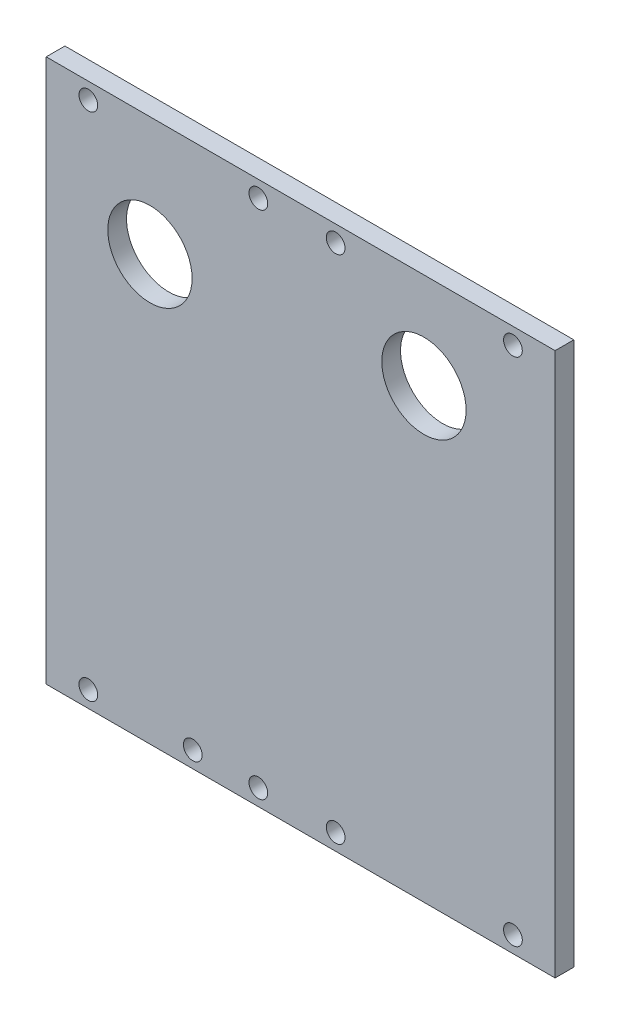
ISO-10303-21;
HEADER;
FILE_DESCRIPTION(('STEP AP214'),'2;1');
FILE_NAME('part.step','',(''),(''),'','','');
FILE_SCHEMA(('AUTOMOTIVE_DESIGN { 1 0 10303 214 1 1 1 1 }'));
ENDSEC;
DATA;
#1=APPLICATION_CONTEXT('core data for automotive mechanical design processes');
#2=APPLICATION_PROTOCOL_DEFINITION('international standard','automotive_design',2000,#1);
#3=PRODUCT_CONTEXT('',#1,'mechanical');
#4=PRODUCT('Part','Part','',(#3));
#5=PRODUCT_RELATED_PRODUCT_CATEGORY('part','',(#4));
#6=PRODUCT_DEFINITION_FORMATION('','',#4);
#7=PRODUCT_DEFINITION_CONTEXT('part definition',#1,'design');
#8=PRODUCT_DEFINITION('design','',#6,#7);
#9=PRODUCT_DEFINITION_SHAPE('','',#8);
#10=(LENGTH_UNIT() NAMED_UNIT(*) SI_UNIT(.MILLI.,.METRE.));
#11=(NAMED_UNIT(*) PLANE_ANGLE_UNIT() SI_UNIT($,.RADIAN.));
#12=(NAMED_UNIT(*) SI_UNIT($,.STERADIAN.) SOLID_ANGLE_UNIT());
#13=UNCERTAINTY_MEASURE_WITH_UNIT(LENGTH_MEASURE(1.E-05),#10,'distance_accuracy_value','');
#14=(GEOMETRIC_REPRESENTATION_CONTEXT(3) GLOBAL_UNCERTAINTY_ASSIGNED_CONTEXT((#13)) GLOBAL_UNIT_ASSIGNED_CONTEXT((#10,
#11,#12)) REPRESENTATION_CONTEXT('',''));
#15=CARTESIAN_POINT('',(0.,0.,0.));
#16=DIRECTION('',(0.,0.,1.));
#17=DIRECTION('',(1.,0.,0.));
#18=AXIS2_PLACEMENT_3D('',#15,#16,#17);
#19=CARTESIAN_POINT('',(54.325,-58.,4.));
#20=DIRECTION('',(-1.,0.,0.));
#21=DIRECTION('',(0.,0.,1.));
#22=AXIS2_PLACEMENT_3D('',#19,#20,#21);
#23=PLANE('',#22);
#24=DIRECTION('',(0.,1.,0.));
#25=VECTOR('',#24,1.);
#26=CARTESIAN_POINT('',(54.325,-58.,0.));
#27=LINE('',#26,#25);
#28=CARTESIAN_POINT('',(54.325,-58.,0.));
#29=VERTEX_POINT('',#28);
#30=CARTESIAN_POINT('',(54.325,58.,0.));
#31=VERTEX_POINT('',#30);
#32=EDGE_CURVE('E102',#29,#31,#27,.T.);
#33=ORIENTED_EDGE('',*,*,#32,.T.);
#34=DIRECTION('',(0.,0.,-1.));
#35=VECTOR('',#34,1.);
#36=CARTESIAN_POINT('',(54.325,58.,4.));
#37=LINE('',#36,#35);
#38=CARTESIAN_POINT('',(54.325,58.,4.));
#39=VERTEX_POINT('',#38);
#40=EDGE_CURVE('E11',#39,#31,#37,.T.);
#41=ORIENTED_EDGE('',*,*,#40,.F.);
#42=DIRECTION('',(0.,1.,0.));
#43=VECTOR('',#42,1.);
#44=CARTESIAN_POINT('',(54.325,-58.,4.));
#45=LINE('',#44,#43);
#46=CARTESIAN_POINT('',(54.325,-58.,4.));
#47=VERTEX_POINT('',#46);
#48=EDGE_CURVE('E90',#47,#39,#45,.T.);
#49=ORIENTED_EDGE('',*,*,#48,.F.);
#50=DIRECTION('',(0.,0.,-1.));
#51=VECTOR('',#50,1.);
#52=CARTESIAN_POINT('',(54.325,-58.,4.));
#53=LINE('',#52,#51);
#54=EDGE_CURVE('E98',#47,#29,#53,.T.);
#55=ORIENTED_EDGE('',*,*,#54,.T.);
#56=EDGE_LOOP('',(#33,#41,#49,#55));
#57=FACE_BOUND('',#56,.T.);
#58=ADVANCED_FACE('F39',(#57),#23,.F.);
#59=CARTESIAN_POINT('',(-54.325,58.,4.));
#60=DIRECTION('',(0.,-1.,0.));
#61=DIRECTION('',(0.,0.,-1.));
#62=AXIS2_PLACEMENT_3D('',#59,#60,#61);
#63=PLANE('',#62);
#64=DIRECTION('',(-1.,0.,0.));
#65=VECTOR('',#64,1.);
#66=CARTESIAN_POINT('',(-54.325,58.,0.));
#67=LINE('',#66,#65);
#68=CARTESIAN_POINT('',(-54.325,58.,0.));
#69=VERTEX_POINT('',#68);
#70=EDGE_CURVE('E94',#31,#69,#67,.T.);
#71=ORIENTED_EDGE('',*,*,#70,.T.);
#72=DIRECTION('',(0.,0.,-1.));
#73=VECTOR('',#72,1.);
#74=CARTESIAN_POINT('',(-54.325,58.,4.));
#75=LINE('',#74,#73);
#76=CARTESIAN_POINT('',(-54.325,58.,4.));
#77=VERTEX_POINT('',#76);
#78=EDGE_CURVE('E47',#77,#69,#75,.T.);
#79=ORIENTED_EDGE('',*,*,#78,.F.);
#80=DIRECTION('',(-1.,0.,0.));
#81=VECTOR('',#80,1.);
#82=CARTESIAN_POINT('',(-54.325,58.,4.));
#83=LINE('',#82,#81);
#84=EDGE_CURVE('E85',#39,#77,#83,.T.);
#85=ORIENTED_EDGE('',*,*,#84,.F.);
#86=ORIENTED_EDGE('',*,*,#40,.T.);
#87=EDGE_LOOP('',(#71,#79,#85,#86));
#88=FACE_BOUND('',#87,.T.);
#89=ADVANCED_FACE('F93',(#88),#63,.F.);
#90=CARTESIAN_POINT('',(-54.325,-58.,4.));
#91=DIRECTION('',(1.,0.,0.));
#92=DIRECTION('',(0.,0.,-1.));
#93=AXIS2_PLACEMENT_3D('',#90,#91,#92);
#94=PLANE('',#93);
#95=DIRECTION('',(0.,-1.,0.));
#96=VECTOR('',#95,1.);
#97=CARTESIAN_POINT('',(-54.325,-58.,0.));
#98=LINE('',#97,#96);
#99=CARTESIAN_POINT('',(-54.325,-58.,0.));
#100=VERTEX_POINT('',#99);
#101=EDGE_CURVE('E72',#69,#100,#98,.T.);
#102=ORIENTED_EDGE('',*,*,#101,.T.);
#103=DIRECTION('',(0.,0.,-1.));
#104=VECTOR('',#103,1.);
#105=CARTESIAN_POINT('',(-54.325,-58.,4.));
#106=LINE('',#105,#104);
#107=CARTESIAN_POINT('',(-54.325,-58.,4.));
#108=VERTEX_POINT('',#107);
#109=EDGE_CURVE('E95',#108,#100,#106,.T.);
#110=ORIENTED_EDGE('',*,*,#109,.F.);
#111=DIRECTION('',(0.,-1.,0.));
#112=VECTOR('',#111,1.);
#113=CARTESIAN_POINT('',(-54.325,-58.,4.));
#114=LINE('',#113,#112);
#115=EDGE_CURVE('E88',#77,#108,#114,.T.);
#116=ORIENTED_EDGE('',*,*,#115,.F.);
#117=ORIENTED_EDGE('',*,*,#78,.T.);
#118=EDGE_LOOP('',(#102,#110,#116,#117));
#119=FACE_BOUND('',#118,.T.);
#120=ADVANCED_FACE('F96',(#119),#94,.F.);
#121=CARTESIAN_POINT('',(-54.325,-58.,4.));
#122=DIRECTION('',(0.,1.,0.));
#123=DIRECTION('',(0.,0.,1.));
#124=AXIS2_PLACEMENT_3D('',#121,#122,#123);
#125=PLANE('',#124);
#126=DIRECTION('',(1.,0.,0.));
#127=VECTOR('',#126,1.);
#128=CARTESIAN_POINT('',(-54.325,-58.,0.));
#129=LINE('',#128,#127);
#130=EDGE_CURVE('E78',#100,#29,#129,.T.);
#131=ORIENTED_EDGE('',*,*,#130,.T.);
#132=ORIENTED_EDGE('',*,*,#54,.F.);
#133=DIRECTION('',(1.,0.,0.));
#134=VECTOR('',#133,1.);
#135=CARTESIAN_POINT('',(-54.325,-58.,4.));
#136=LINE('',#135,#134);
#137=EDGE_CURVE('E55',#108,#47,#136,.T.);
#138=ORIENTED_EDGE('',*,*,#137,.F.);
#139=ORIENTED_EDGE('',*,*,#109,.T.);
#140=EDGE_LOOP('',(#131,#132,#138,#139));
#141=FACE_BOUND('',#140,.T.);
#142=ADVANCED_FACE('F110',(#141),#125,.F.);
#143=CARTESIAN_POINT('',(0.,0.,4.));
#144=DIRECTION('',(0.,0.,-1.));
#145=DIRECTION('',(-1.,0.,0.));
#146=AXIS2_PLACEMENT_3D('',#143,#144,#145);
#147=PLANE('',#146);
#148=CARTESIAN_POINT('',(45.325,-54.5,4.));
#149=DIRECTION('',(0.,0.,1.));
#150=DIRECTION('',(-1.,0.,0.));
#151=AXIS2_PLACEMENT_3D('',#148,#149,#150);
#152=CIRCLE('',#151,2.);
#153=CARTESIAN_POINT('',(43.325,-54.5,4.));
#154=VERTEX_POINT('',#153);
#155=EDGE_CURVE('E137',#154,#154,#152,.T.);
#156=ORIENTED_EDGE('',*,*,#155,.F.);
#157=EDGE_LOOP('',(#156));
#158=FACE_BOUND('',#157,.T.);
#159=CARTESIAN_POINT('',(45.325,54.5,4.));
#160=DIRECTION('',(0.,0.,1.));
#161=DIRECTION('',(1.,0.,0.));
#162=AXIS2_PLACEMENT_3D('',#159,#160,#161);
#163=CIRCLE('',#162,2.);
#164=CARTESIAN_POINT('',(47.325,54.5,4.));
#165=VERTEX_POINT('',#164);
#166=EDGE_CURVE('E143',#165,#165,#163,.T.);
#167=ORIENTED_EDGE('',*,*,#166,.F.);
#168=EDGE_LOOP('',(#167));
#169=FACE_BOUND('',#168,.T.);
#170=CARTESIAN_POINT('',(7.47500000000001,-54.5,4.));
#171=DIRECTION('',(0.,0.,1.));
#172=DIRECTION('',(-1.,0.,0.));
#173=AXIS2_PLACEMENT_3D('',#170,#171,#172);
#174=CIRCLE('',#173,2.);
#175=CARTESIAN_POINT('',(5.47500000000001,-54.5,4.));
#176=VERTEX_POINT('',#175);
#177=EDGE_CURVE('E149',#176,#176,#174,.T.);
#178=ORIENTED_EDGE('',*,*,#177,.F.);
#179=EDGE_LOOP('',(#178));
#180=FACE_BOUND('',#179,.T.);
#181=CARTESIAN_POINT('',(7.47500000000001,54.5,4.));
#182=DIRECTION('',(0.,0.,1.));
#183=DIRECTION('',(1.,0.,0.));
#184=AXIS2_PLACEMENT_3D('',#181,#182,#183);
#185=CIRCLE('',#184,2.);
#186=CARTESIAN_POINT('',(9.47500000000001,54.5,4.));
#187=VERTEX_POINT('',#186);
#188=EDGE_CURVE('E155',#187,#187,#185,.T.);
#189=ORIENTED_EDGE('',*,*,#188,.F.);
#190=EDGE_LOOP('',(#189));
#191=FACE_BOUND('',#190,.T.);
#192=CARTESIAN_POINT('',(-45.325,-54.5,4.));
#193=DIRECTION('',(0.,0.,1.));
#194=DIRECTION('',(-1.,0.,0.));
#195=AXIS2_PLACEMENT_3D('',#192,#193,#194);
#196=CIRCLE('',#195,2.);
#197=CARTESIAN_POINT('',(-47.325,-54.5,4.));
#198=VERTEX_POINT('',#197);
#199=EDGE_CURVE('E131',#198,#198,#196,.T.);
#200=ORIENTED_EDGE('',*,*,#199,.F.);
#201=EDGE_LOOP('',(#200));
#202=FACE_BOUND('',#201,.T.);
#203=CARTESIAN_POINT('',(-9.02499999999999,54.5,4.));
#204=DIRECTION('',(0.,0.,1.));
#205=DIRECTION('',(-1.,0.,0.));
#206=AXIS2_PLACEMENT_3D('',#203,#204,#205);
#207=CIRCLE('',#206,2.);
#208=CARTESIAN_POINT('',(-11.025,54.5,4.));
#209=VERTEX_POINT('',#208);
#210=EDGE_CURVE('E162',#209,#209,#207,.T.);
#211=ORIENTED_EDGE('',*,*,#210,.F.);
#212=EDGE_LOOP('',(#211));
#213=FACE_BOUND('',#212,.T.);
#214=CARTESIAN_POINT('',(-9.02499999999999,-54.5,4.));
#215=DIRECTION('',(0.,0.,1.));
#216=DIRECTION('',(1.,0.,0.));
#217=AXIS2_PLACEMENT_3D('',#214,#215,#216);
#218=CIRCLE('',#217,2.);
#219=CARTESIAN_POINT('',(-7.02499999999999,-54.5,4.));
#220=VERTEX_POINT('',#219);
#221=EDGE_CURVE('E163',#220,#220,#218,.T.);
#222=ORIENTED_EDGE('',*,*,#221,.F.);
#223=EDGE_LOOP('',(#222));
#224=FACE_BOUND('',#223,.T.);
#225=CARTESIAN_POINT('',(-23.025,-54.5,4.));
#226=DIRECTION('',(0.,0.,1.));
#227=DIRECTION('',(-1.,0.,0.));
#228=AXIS2_PLACEMENT_3D('',#225,#226,#227);
#229=CIRCLE('',#228,2.);
#230=CARTESIAN_POINT('',(-25.025,-54.5,4.));
#231=VERTEX_POINT('',#230);
#232=EDGE_CURVE('E173',#231,#231,#229,.T.);
#233=ORIENTED_EDGE('',*,*,#232,.F.);
#234=EDGE_LOOP('',(#233));
#235=FACE_BOUND('',#234,.T.);
#236=CARTESIAN_POINT('',(-45.325,54.5,4.));
#237=DIRECTION('',(0.,0.,1.));
#238=DIRECTION('',(1.,0.,0.));
#239=AXIS2_PLACEMENT_3D('',#236,#237,#238);
#240=CIRCLE('',#239,2.);
#241=CARTESIAN_POINT('',(-43.325,54.5,4.));
#242=VERTEX_POINT('',#241);
#243=EDGE_CURVE('E128',#242,#242,#240,.T.);
#244=ORIENTED_EDGE('',*,*,#243,.F.);
#245=EDGE_LOOP('',(#244));
#246=FACE_BOUND('',#245,.T.);
#247=CARTESIAN_POINT('',(26.325,37.5,4.));
#248=DIRECTION('',(0.,0.,1.));
#249=DIRECTION('',(1.,0.,0.));
#250=AXIS2_PLACEMENT_3D('',#247,#248,#249);
#251=CIRCLE('',#250,9.);
#252=CARTESIAN_POINT('',(35.325,37.5,4.));
#253=VERTEX_POINT('',#252);
#254=EDGE_CURVE('E123',#253,#253,#251,.T.);
#255=ORIENTED_EDGE('',*,*,#254,.F.);
#256=EDGE_LOOP('',(#255));
#257=FACE_BOUND('',#256,.T.);
#258=CARTESIAN_POINT('',(-32.175,32.6,4.));
#259=DIRECTION('',(0.,0.,1.));
#260=DIRECTION('',(1.,0.,0.));
#261=AXIS2_PLACEMENT_3D('',#258,#259,#260);
#262=CIRCLE('',#261,9.);
#263=CARTESIAN_POINT('',(-23.175,32.6,4.));
#264=VERTEX_POINT('',#263);
#265=EDGE_CURVE('E119',#264,#264,#262,.T.);
#266=ORIENTED_EDGE('',*,*,#265,.F.);
#267=EDGE_LOOP('',(#266));
#268=FACE_BOUND('',#267,.T.);
#269=ORIENTED_EDGE('',*,*,#48,.T.);
#270=ORIENTED_EDGE('',*,*,#84,.T.);
#271=ORIENTED_EDGE('',*,*,#115,.T.);
#272=ORIENTED_EDGE('',*,*,#137,.T.);
#273=EDGE_LOOP('',(#269,#270,#271,#272));
#274=FACE_BOUND('',#273,.T.);
#275=ADVANCED_FACE('F86',(#158,#169,#180,#191,#202,#213,#224,#235,#246,#257,#268,#274),#147,.F.);
#276=CARTESIAN_POINT('',(0.,0.,0.));
#277=DIRECTION('',(0.,0.,-1.));
#278=DIRECTION('',(-1.,0.,0.));
#279=AXIS2_PLACEMENT_3D('',#276,#277,#278);
#280=PLANE('',#279);
#281=CARTESIAN_POINT('',(45.325,-54.5,0.));
#282=DIRECTION('',(0.,0.,1.));
#283=DIRECTION('',(-1.,0.,0.));
#284=AXIS2_PLACEMENT_3D('',#281,#282,#283);
#285=CIRCLE('',#284,2.);
#286=CARTESIAN_POINT('',(43.325,-54.5,0.));
#287=VERTEX_POINT('',#286);
#288=EDGE_CURVE('E134',#287,#287,#285,.T.);
#289=ORIENTED_EDGE('',*,*,#288,.T.);
#290=EDGE_LOOP('',(#289));
#291=FACE_BOUND('',#290,.T.);
#292=CARTESIAN_POINT('',(45.325,54.5,0.));
#293=DIRECTION('',(0.,0.,1.));
#294=DIRECTION('',(1.,0.,0.));
#295=AXIS2_PLACEMENT_3D('',#292,#293,#294);
#296=CIRCLE('',#295,2.);
#297=CARTESIAN_POINT('',(47.325,54.5,0.));
#298=VERTEX_POINT('',#297);
#299=EDGE_CURVE('E140',#298,#298,#296,.T.);
#300=ORIENTED_EDGE('',*,*,#299,.T.);
#301=EDGE_LOOP('',(#300));
#302=FACE_BOUND('',#301,.T.);
#303=CARTESIAN_POINT('',(7.47500000000001,-54.5,0.));
#304=DIRECTION('',(0.,0.,1.));
#305=DIRECTION('',(-1.,0.,0.));
#306=AXIS2_PLACEMENT_3D('',#303,#304,#305);
#307=CIRCLE('',#306,2.);
#308=CARTESIAN_POINT('',(5.47500000000001,-54.5,0.));
#309=VERTEX_POINT('',#308);
#310=EDGE_CURVE('E146',#309,#309,#307,.T.);
#311=ORIENTED_EDGE('',*,*,#310,.T.);
#312=EDGE_LOOP('',(#311));
#313=FACE_BOUND('',#312,.T.);
#314=CARTESIAN_POINT('',(7.47500000000001,54.5,0.));
#315=DIRECTION('',(0.,0.,1.));
#316=DIRECTION('',(1.,0.,0.));
#317=AXIS2_PLACEMENT_3D('',#314,#315,#316);
#318=CIRCLE('',#317,2.);
#319=CARTESIAN_POINT('',(9.47500000000001,54.5,0.));
#320=VERTEX_POINT('',#319);
#321=EDGE_CURVE('E152',#320,#320,#318,.T.);
#322=ORIENTED_EDGE('',*,*,#321,.T.);
#323=EDGE_LOOP('',(#322));
#324=FACE_BOUND('',#323,.T.);
#325=CARTESIAN_POINT('',(-45.325,-54.5,0.));
#326=DIRECTION('',(0.,0.,1.));
#327=DIRECTION('',(-1.,0.,0.));
#328=AXIS2_PLACEMENT_3D('',#325,#326,#327);
#329=CIRCLE('',#328,2.);
#330=CARTESIAN_POINT('',(-47.325,-54.5,0.));
#331=VERTEX_POINT('',#330);
#332=EDGE_CURVE('E166',#331,#331,#329,.T.);
#333=ORIENTED_EDGE('',*,*,#332,.T.);
#334=EDGE_LOOP('',(#333));
#335=FACE_BOUND('',#334,.T.);
#336=CARTESIAN_POINT('',(-9.02499999999999,54.5,0.));
#337=DIRECTION('',(0.,0.,1.));
#338=DIRECTION('',(-1.,0.,0.));
#339=AXIS2_PLACEMENT_3D('',#336,#337,#338);
#340=CIRCLE('',#339,2.);
#341=CARTESIAN_POINT('',(-11.025,54.5,0.));
#342=VERTEX_POINT('',#341);
#343=EDGE_CURVE('E159',#342,#342,#340,.T.);
#344=ORIENTED_EDGE('',*,*,#343,.T.);
#345=EDGE_LOOP('',(#344));
#346=FACE_BOUND('',#345,.T.);
#347=CARTESIAN_POINT('',(-9.02499999999999,-54.5,0.));
#348=DIRECTION('',(0.,0.,1.));
#349=DIRECTION('',(1.,0.,0.));
#350=AXIS2_PLACEMENT_3D('',#347,#348,#349);
#351=CIRCLE('',#350,2.);
#352=CARTESIAN_POINT('',(-7.02499999999999,-54.5,0.));
#353=VERTEX_POINT('',#352);
#354=EDGE_CURVE('E176',#353,#353,#351,.T.);
#355=ORIENTED_EDGE('',*,*,#354,.T.);
#356=EDGE_LOOP('',(#355));
#357=FACE_BOUND('',#356,.T.);
#358=CARTESIAN_POINT('',(-23.025,-54.5,0.));
#359=DIRECTION('',(0.,0.,1.));
#360=DIRECTION('',(-1.,0.,0.));
#361=AXIS2_PLACEMENT_3D('',#358,#359,#360);
#362=CIRCLE('',#361,2.);
#363=CARTESIAN_POINT('',(-25.025,-54.5,0.));
#364=VERTEX_POINT('',#363);
#365=EDGE_CURVE('E158',#364,#364,#362,.T.);
#366=ORIENTED_EDGE('',*,*,#365,.T.);
#367=EDGE_LOOP('',(#366));
#368=FACE_BOUND('',#367,.T.);
#369=CARTESIAN_POINT('',(-45.325,54.5,0.));
#370=DIRECTION('',(0.,0.,1.));
#371=DIRECTION('',(1.,0.,0.));
#372=AXIS2_PLACEMENT_3D('',#369,#370,#371);
#373=CIRCLE('',#372,2.);
#374=CARTESIAN_POINT('',(-43.325,54.5,0.));
#375=VERTEX_POINT('',#374);
#376=EDGE_CURVE('E120',#375,#375,#373,.T.);
#377=ORIENTED_EDGE('',*,*,#376,.T.);
#378=EDGE_LOOP('',(#377));
#379=FACE_BOUND('',#378,.T.);
#380=CARTESIAN_POINT('',(26.325,37.5,0.));
#381=DIRECTION('',(0.,0.,1.));
#382=DIRECTION('',(1.,0.,0.));
#383=AXIS2_PLACEMENT_3D('',#380,#381,#382);
#384=CIRCLE('',#383,9.);
#385=CARTESIAN_POINT('',(35.325,37.5,0.));
#386=VERTEX_POINT('',#385);
#387=EDGE_CURVE('E105',#386,#386,#384,.T.);
#388=ORIENTED_EDGE('',*,*,#387,.T.);
#389=EDGE_LOOP('',(#388));
#390=FACE_BOUND('',#389,.T.);
#391=CARTESIAN_POINT('',(-32.175,32.6,0.));
#392=DIRECTION('',(0.,0.,1.));
#393=DIRECTION('',(1.,0.,0.));
#394=AXIS2_PLACEMENT_3D('',#391,#392,#393);
#395=CIRCLE('',#394,9.);
#396=CARTESIAN_POINT('',(-23.175,32.6,0.));
#397=VERTEX_POINT('',#396);
#398=EDGE_CURVE('E116',#397,#397,#395,.T.);
#399=ORIENTED_EDGE('',*,*,#398,.T.);
#400=EDGE_LOOP('',(#399));
#401=FACE_BOUND('',#400,.T.);
#402=ORIENTED_EDGE('',*,*,#32,.F.);
#403=ORIENTED_EDGE('',*,*,#130,.F.);
#404=ORIENTED_EDGE('',*,*,#101,.F.);
#405=ORIENTED_EDGE('',*,*,#70,.F.);
#406=EDGE_LOOP('',(#402,#403,#404,#405));
#407=FACE_BOUND('',#406,.T.);
#408=ADVANCED_FACE('F113',(#291,#302,#313,#324,#335,#346,#357,#368,#379,#390,#401,#407),#280,.T.);
#409=CARTESIAN_POINT('',(-32.175,32.6,0.));
#410=DIRECTION('',(0.,0.,1.));
#411=DIRECTION('',(1.,0.,0.));
#412=AXIS2_PLACEMENT_3D('',#409,#410,#411);
#413=CYLINDRICAL_SURFACE('',#412,9.);
#414=ORIENTED_EDGE('',*,*,#398,.F.);
#415=EDGE_LOOP('',(#414));
#416=FACE_BOUND('',#415,.T.);
#417=ORIENTED_EDGE('',*,*,#265,.T.);
#418=EDGE_LOOP('',(#417));
#419=FACE_BOUND('',#418,.T.);
#420=ADVANCED_FACE('F196',(#416,#419),#413,.F.);
#421=CARTESIAN_POINT('',(26.325,37.5,0.));
#422=DIRECTION('',(0.,0.,1.));
#423=DIRECTION('',(1.,0.,0.));
#424=AXIS2_PLACEMENT_3D('',#421,#422,#423);
#425=CYLINDRICAL_SURFACE('',#424,9.);
#426=ORIENTED_EDGE('',*,*,#387,.F.);
#427=EDGE_LOOP('',(#426));
#428=FACE_BOUND('',#427,.T.);
#429=ORIENTED_EDGE('',*,*,#254,.T.);
#430=EDGE_LOOP('',(#429));
#431=FACE_BOUND('',#430,.T.);
#432=ADVANCED_FACE('F198',(#428,#431),#425,.F.);
#433=CARTESIAN_POINT('',(-45.325,54.5,0.));
#434=DIRECTION('',(0.,0.,1.));
#435=DIRECTION('',(1.,0.,0.));
#436=AXIS2_PLACEMENT_3D('',#433,#434,#435);
#437=CYLINDRICAL_SURFACE('',#436,2.);
#438=ORIENTED_EDGE('',*,*,#376,.F.);
#439=EDGE_LOOP('',(#438));
#440=FACE_BOUND('',#439,.T.);
#441=ORIENTED_EDGE('',*,*,#243,.T.);
#442=EDGE_LOOP('',(#441));
#443=FACE_BOUND('',#442,.T.);
#444=ADVANCED_FACE('F205',(#440,#443),#437,.F.);
#445=CARTESIAN_POINT('',(-23.025,-54.5,0.));
#446=DIRECTION('',(0.,0.,1.));
#447=DIRECTION('',(1.,0.,0.));
#448=AXIS2_PLACEMENT_3D('',#445,#446,#447);
#449=CYLINDRICAL_SURFACE('',#448,2.);
#450=ORIENTED_EDGE('',*,*,#365,.F.);
#451=EDGE_LOOP('',(#450));
#452=FACE_BOUND('',#451,.T.);
#453=ORIENTED_EDGE('',*,*,#232,.T.);
#454=EDGE_LOOP('',(#453));
#455=FACE_BOUND('',#454,.T.);
#456=ADVANCED_FACE('F265',(#452,#455),#449,.F.);
#457=CARTESIAN_POINT('',(-9.02499999999999,-54.5,0.));
#458=DIRECTION('',(0.,0.,1.));
#459=DIRECTION('',(1.,0.,0.));
#460=AXIS2_PLACEMENT_3D('',#457,#458,#459);
#461=CYLINDRICAL_SURFACE('',#460,2.);
#462=ORIENTED_EDGE('',*,*,#354,.F.);
#463=EDGE_LOOP('',(#462));
#464=FACE_BOUND('',#463,.T.);
#465=ORIENTED_EDGE('',*,*,#221,.T.);
#466=EDGE_LOOP('',(#465));
#467=FACE_BOUND('',#466,.T.);
#468=ADVANCED_FACE('F182',(#464,#467),#461,.F.);
#469=CARTESIAN_POINT('',(-9.02499999999999,54.5,0.));
#470=DIRECTION('',(0.,0.,1.));
#471=DIRECTION('',(1.,0.,0.));
#472=AXIS2_PLACEMENT_3D('',#469,#470,#471);
#473=CYLINDRICAL_SURFACE('',#472,2.);
#474=ORIENTED_EDGE('',*,*,#343,.F.);
#475=EDGE_LOOP('',(#474));
#476=FACE_BOUND('',#475,.T.);
#477=ORIENTED_EDGE('',*,*,#210,.T.);
#478=EDGE_LOOP('',(#477));
#479=FACE_BOUND('',#478,.T.);
#480=ADVANCED_FACE('F282',(#476,#479),#473,.F.);
#481=CARTESIAN_POINT('',(-45.325,-54.5,0.));
#482=DIRECTION('',(0.,0.,1.));
#483=DIRECTION('',(1.,0.,0.));
#484=AXIS2_PLACEMENT_3D('',#481,#482,#483);
#485=CYLINDRICAL_SURFACE('',#484,2.);
#486=ORIENTED_EDGE('',*,*,#332,.F.);
#487=EDGE_LOOP('',(#486));
#488=FACE_BOUND('',#487,.T.);
#489=ORIENTED_EDGE('',*,*,#199,.T.);
#490=EDGE_LOOP('',(#489));
#491=FACE_BOUND('',#490,.T.);
#492=ADVANCED_FACE('F291',(#488,#491),#485,.F.);
#493=CARTESIAN_POINT('',(7.47500000000001,54.5,0.));
#494=DIRECTION('',(0.,0.,1.));
#495=DIRECTION('',(1.,0.,0.));
#496=AXIS2_PLACEMENT_3D('',#493,#494,#495);
#497=CYLINDRICAL_SURFACE('',#496,2.);
#498=ORIENTED_EDGE('',*,*,#321,.F.);
#499=EDGE_LOOP('',(#498));
#500=FACE_BOUND('',#499,.T.);
#501=ORIENTED_EDGE('',*,*,#188,.T.);
#502=EDGE_LOOP('',(#501));
#503=FACE_BOUND('',#502,.T.);
#504=ADVANCED_FACE('F300',(#500,#503),#497,.F.);
#505=CARTESIAN_POINT('',(7.47500000000001,-54.5,0.));
#506=DIRECTION('',(0.,0.,1.));
#507=DIRECTION('',(1.,0.,0.));
#508=AXIS2_PLACEMENT_3D('',#505,#506,#507);
#509=CYLINDRICAL_SURFACE('',#508,2.);
#510=ORIENTED_EDGE('',*,*,#310,.F.);
#511=EDGE_LOOP('',(#510));
#512=FACE_BOUND('',#511,.T.);
#513=ORIENTED_EDGE('',*,*,#177,.T.);
#514=EDGE_LOOP('',(#513));
#515=FACE_BOUND('',#514,.T.);
#516=ADVANCED_FACE('F309',(#512,#515),#509,.F.);
#517=CARTESIAN_POINT('',(45.325,54.5,0.));
#518=DIRECTION('',(0.,0.,1.));
#519=DIRECTION('',(1.,0.,0.));
#520=AXIS2_PLACEMENT_3D('',#517,#518,#519);
#521=CYLINDRICAL_SURFACE('',#520,2.);
#522=ORIENTED_EDGE('',*,*,#299,.F.);
#523=EDGE_LOOP('',(#522));
#524=FACE_BOUND('',#523,.T.);
#525=ORIENTED_EDGE('',*,*,#166,.T.);
#526=EDGE_LOOP('',(#525));
#527=FACE_BOUND('',#526,.T.);
#528=ADVANCED_FACE('F318',(#524,#527),#521,.F.);
#529=CARTESIAN_POINT('',(45.325,-54.5,0.));
#530=DIRECTION('',(0.,0.,1.));
#531=DIRECTION('',(1.,0.,0.));
#532=AXIS2_PLACEMENT_3D('',#529,#530,#531);
#533=CYLINDRICAL_SURFACE('',#532,2.);
#534=ORIENTED_EDGE('',*,*,#288,.F.);
#535=EDGE_LOOP('',(#534));
#536=FACE_BOUND('',#535,.T.);
#537=ORIENTED_EDGE('',*,*,#155,.T.);
#538=EDGE_LOOP('',(#537));
#539=FACE_BOUND('',#538,.T.);
#540=ADVANCED_FACE('F327',(#536,#539),#533,.F.);
#541=CLOSED_SHELL('',(#58,#89,#120,#142,#275,#408,#420,#432,#444,#456,#468,#480,#492,#504,#516,
#528,#540));
#542=MANIFOLD_SOLID_BREP('B2',#541);
#543=ADVANCED_BREP_SHAPE_REPRESENTATION('',(#18,#542),#14);
#544=SHAPE_DEFINITION_REPRESENTATION(#9,#543);
ENDSEC;
END-ISO-10303-21;
